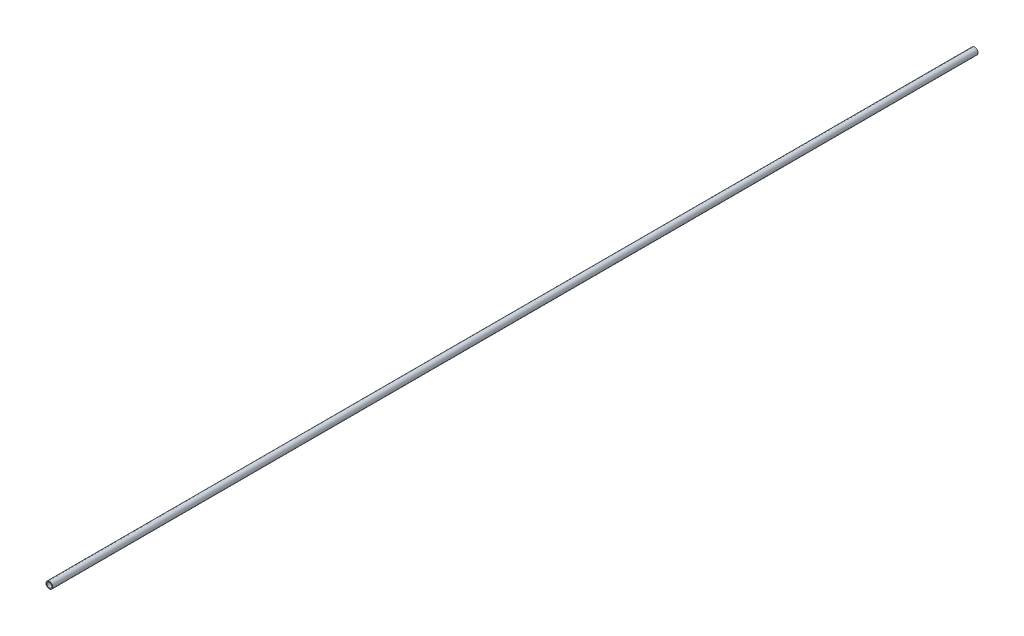
ISO-10303-21;
HEADER;
FILE_DESCRIPTION(('STEP AP214'),'2;1');
FILE_NAME('part.step','',(''),(''),'','','');
FILE_SCHEMA(('AUTOMOTIVE_DESIGN { 1 0 10303 214 1 1 1 1 }'));
ENDSEC;
DATA;
#1=APPLICATION_CONTEXT('core data for automotive mechanical design processes');
#2=APPLICATION_PROTOCOL_DEFINITION('international standard','automotive_design',2000,#1);
#3=PRODUCT_CONTEXT('',#1,'mechanical');
#4=PRODUCT('Part','Part','',(#3));
#5=PRODUCT_RELATED_PRODUCT_CATEGORY('part','',(#4));
#6=PRODUCT_DEFINITION_FORMATION('','',#4);
#7=PRODUCT_DEFINITION_CONTEXT('part definition',#1,'design');
#8=PRODUCT_DEFINITION('design','',#6,#7);
#9=PRODUCT_DEFINITION_SHAPE('','',#8);
#10=(LENGTH_UNIT() NAMED_UNIT(*) SI_UNIT(.MILLI.,.METRE.));
#11=(NAMED_UNIT(*) PLANE_ANGLE_UNIT() SI_UNIT($,.RADIAN.));
#12=(NAMED_UNIT(*) SI_UNIT($,.STERADIAN.) SOLID_ANGLE_UNIT());
#13=UNCERTAINTY_MEASURE_WITH_UNIT(LENGTH_MEASURE(1.E-05),#10,'distance_accuracy_value','');
#14=(GEOMETRIC_REPRESENTATION_CONTEXT(3) GLOBAL_UNCERTAINTY_ASSIGNED_CONTEXT((#13)) GLOBAL_UNIT_ASSIGNED_CONTEXT((#10,
#11,#12)) REPRESENTATION_CONTEXT('',''));
#15=CARTESIAN_POINT('',(0.,0.,0.));
#16=DIRECTION('',(0.,0.,1.));
#17=DIRECTION('',(1.,0.,0.));
#18=AXIS2_PLACEMENT_3D('',#15,#16,#17);
#19=CARTESIAN_POINT('',(0.,0.,1326.3731918));
#20=DIRECTION('',(0.,0.,1.));
#21=DIRECTION('',(1.,0.,0.));
#22=AXIS2_PLACEMENT_3D('',#19,#20,#21);
#23=PLANE('',#22);
#24=CARTESIAN_POINT('',(0.,0.,1326.3731918));
#25=DIRECTION('',(0.,0.,1.));
#26=DIRECTION('',(1.,0.,0.));
#27=AXIS2_PLACEMENT_3D('',#24,#25,#26);
#28=CIRCLE('',#27,4.7625);
#29=CARTESIAN_POINT('',(4.7625,0.,1326.3731918));
#30=VERTEX_POINT('',#29);
#31=EDGE_CURVE('E10',#30,#30,#28,.T.);
#32=ORIENTED_EDGE('',*,*,#31,.T.);
#33=EDGE_LOOP('',(#32));
#34=FACE_BOUND('',#33,.T.);
#35=CARTESIAN_POINT('',(0.,0.,1326.3731918));
#36=DIRECTION('',(0.,0.,1.));
#37=DIRECTION('',(1.,0.,0.));
#38=AXIS2_PLACEMENT_3D('',#35,#36,#37);
#39=CIRCLE('',#38,3.5179);
#40=CARTESIAN_POINT('',(3.5179,0.,1326.3731918));
#41=VERTEX_POINT('',#40);
#42=EDGE_CURVE('E56',#41,#41,#39,.T.);
#43=ORIENTED_EDGE('',*,*,#42,.F.);
#44=EDGE_LOOP('',(#43));
#45=FACE_BOUND('',#44,.T.);
#46=ADVANCED_FACE('F43',(#34,#45),#23,.T.);
#47=CARTESIAN_POINT('',(0.,0.,0.));
#48=DIRECTION('',(0.,0.,1.));
#49=DIRECTION('',(1.,0.,0.));
#50=AXIS2_PLACEMENT_3D('',#47,#48,#49);
#51=PLANE('',#50);
#52=CARTESIAN_POINT('',(0.,0.,0.));
#53=DIRECTION('',(0.,0.,1.));
#54=DIRECTION('',(1.,0.,0.));
#55=AXIS2_PLACEMENT_3D('',#52,#53,#54);
#56=CIRCLE('',#55,4.7625);
#57=CARTESIAN_POINT('',(4.7625,0.,0.));
#58=VERTEX_POINT('',#57);
#59=EDGE_CURVE('E47',#58,#58,#56,.T.);
#60=ORIENTED_EDGE('',*,*,#59,.F.);
#61=EDGE_LOOP('',(#60));
#62=FACE_BOUND('',#61,.T.);
#63=CARTESIAN_POINT('',(0.,0.,0.));
#64=DIRECTION('',(0.,0.,1.));
#65=DIRECTION('',(1.,0.,0.));
#66=AXIS2_PLACEMENT_3D('',#63,#64,#65);
#67=CIRCLE('',#66,3.5179);
#68=CARTESIAN_POINT('',(3.5179,0.,0.));
#69=VERTEX_POINT('',#68);
#70=EDGE_CURVE('E58',#69,#69,#67,.T.);
#71=ORIENTED_EDGE('',*,*,#70,.T.);
#72=EDGE_LOOP('',(#71));
#73=FACE_BOUND('',#72,.T.);
#74=ADVANCED_FACE('F70',(#62,#73),#51,.F.);
#75=CARTESIAN_POINT('',(0.,0.,1326.3731918));
#76=DIRECTION('',(0.,0.,-1.));
#77=DIRECTION('',(-1.,0.,0.));
#78=AXIS2_PLACEMENT_3D('',#75,#76,#77);
#79=CYLINDRICAL_SURFACE('',#78,4.7625);
#80=ORIENTED_EDGE('',*,*,#31,.F.);
#81=EDGE_LOOP('',(#80));
#82=FACE_BOUND('',#81,.T.);
#83=ORIENTED_EDGE('',*,*,#59,.T.);
#84=EDGE_LOOP('',(#83));
#85=FACE_BOUND('',#84,.T.);
#86=ADVANCED_FACE('F45',(#82,#85),#79,.T.);
#87=CARTESIAN_POINT('',(0.,0.,1326.3731918));
#88=DIRECTION('',(0.,0.,-1.));
#89=DIRECTION('',(-1.,0.,0.));
#90=AXIS2_PLACEMENT_3D('',#87,#88,#89);
#91=CYLINDRICAL_SURFACE('',#90,3.5179);
#92=ORIENTED_EDGE('',*,*,#42,.T.);
#93=EDGE_LOOP('',(#92));
#94=FACE_BOUND('',#93,.T.);
#95=ORIENTED_EDGE('',*,*,#70,.F.);
#96=EDGE_LOOP('',(#95));
#97=FACE_BOUND('',#96,.T.);
#98=ADVANCED_FACE('F66',(#94,#97),#91,.F.);
#99=CLOSED_SHELL('',(#46,#74,#86,#98));
#100=MANIFOLD_SOLID_BREP('B2',#99);
#101=ADVANCED_BREP_SHAPE_REPRESENTATION('',(#18,#100),#14);
#102=SHAPE_DEFINITION_REPRESENTATION(#9,#101);
ENDSEC;
END-ISO-10303-21;
